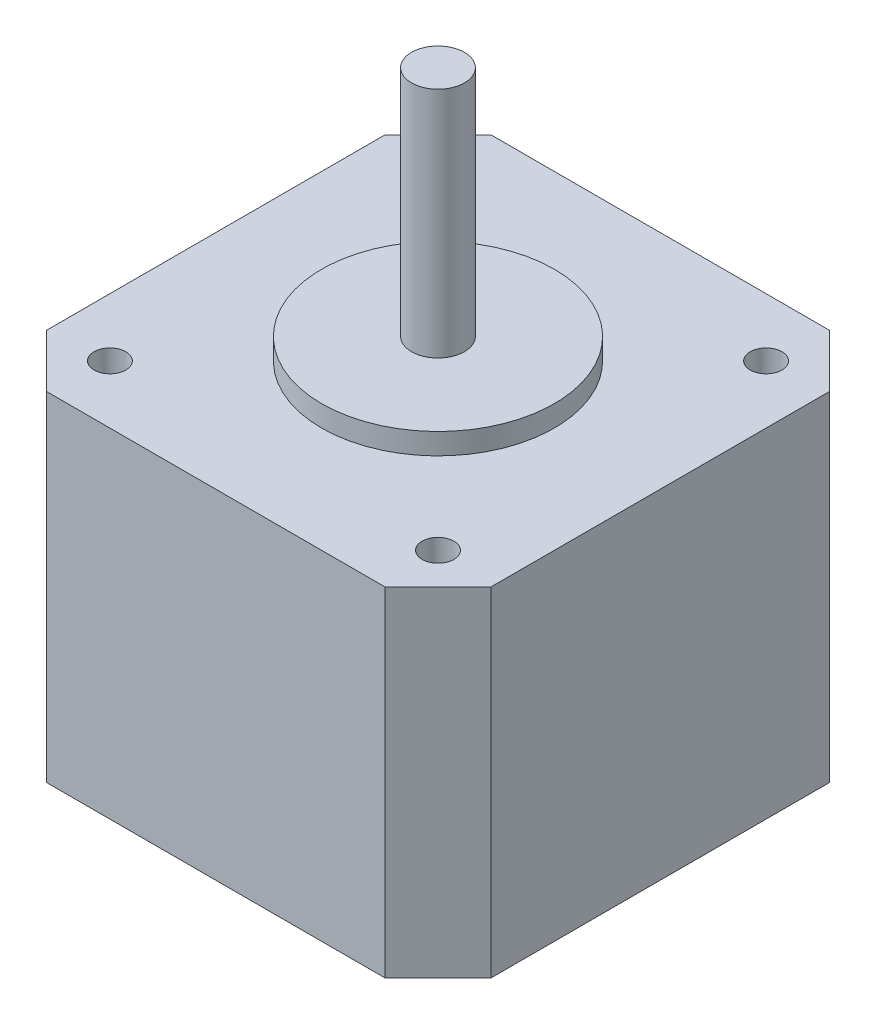
ISO-10303-21;
HEADER;
FILE_DESCRIPTION(('STEP AP214'),'2;1');
FILE_NAME('part.step','',(''),(''),'','','');
FILE_SCHEMA(('AUTOMOTIVE_DESIGN { 1 0 10303 214 1 1 1 1 }'));
ENDSEC;
DATA;
#1=APPLICATION_CONTEXT('core data for automotive mechanical design processes');
#2=APPLICATION_PROTOCOL_DEFINITION('international standard','automotive_design',2000,#1);
#3=PRODUCT_CONTEXT('',#1,'mechanical');
#4=PRODUCT('Part','Part','',(#3));
#5=PRODUCT_RELATED_PRODUCT_CATEGORY('part','',(#4));
#6=PRODUCT_DEFINITION_FORMATION('','',#4);
#7=PRODUCT_DEFINITION_CONTEXT('part definition',#1,'design');
#8=PRODUCT_DEFINITION('design','',#6,#7);
#9=PRODUCT_DEFINITION_SHAPE('','',#8);
#10=(LENGTH_UNIT() NAMED_UNIT(*) SI_UNIT(.MILLI.,.METRE.));
#11=(NAMED_UNIT(*) PLANE_ANGLE_UNIT() SI_UNIT($,.RADIAN.));
#12=(NAMED_UNIT(*) SI_UNIT($,.STERADIAN.) SOLID_ANGLE_UNIT());
#13=UNCERTAINTY_MEASURE_WITH_UNIT(LENGTH_MEASURE(1.E-05),#10,'distance_accuracy_value','');
#14=(GEOMETRIC_REPRESENTATION_CONTEXT(3) GLOBAL_UNCERTAINTY_ASSIGNED_CONTEXT((#13)) GLOBAL_UNIT_ASSIGNED_CONTEXT((#10,
#11,#12)) REPRESENTATION_CONTEXT('',''));
#15=CARTESIAN_POINT('',(0.,0.,0.));
#16=DIRECTION('',(0.,0.,1.));
#17=DIRECTION('',(1.,0.,0.));
#18=AXIS2_PLACEMENT_3D('',#15,#16,#17);
#19=CARTESIAN_POINT('',(21.,32.,21.));
#20=DIRECTION('',(-1.,0.,0.));
#21=DIRECTION('',(0.,0.,1.));
#22=AXIS2_PLACEMENT_3D('',#19,#20,#21);
#23=PLANE('',#22);
#24=DIRECTION('',(0.,0.,-1.));
#25=VECTOR('',#24,1.);
#26=CARTESIAN_POINT('',(21.,32.,21.));
#27=LINE('',#26,#25);
#28=CARTESIAN_POINT('',(21.,32.,16.));
#29=VERTEX_POINT('',#28);
#30=CARTESIAN_POINT('',(21.,32.,-16.));
#31=VERTEX_POINT('',#30);
#32=EDGE_CURVE('E117',#29,#31,#27,.T.);
#33=ORIENTED_EDGE('',*,*,#32,.F.);
#34=DIRECTION('',(0.,-1.,0.));
#35=VECTOR('',#34,1.);
#36=CARTESIAN_POINT('',(21.,32.,16.));
#37=LINE('',#36,#35);
#38=CARTESIAN_POINT('',(21.,0.,16.));
#39=VERTEX_POINT('',#38);
#40=EDGE_CURVE('E102',#29,#39,#37,.T.);
#41=ORIENTED_EDGE('',*,*,#40,.T.);
#42=DIRECTION('',(0.,0.,-1.));
#43=VECTOR('',#42,1.);
#44=CARTESIAN_POINT('',(21.,0.,21.));
#45=LINE('',#44,#43);
#46=CARTESIAN_POINT('',(21.,0.,-16.));
#47=VERTEX_POINT('',#46);
#48=EDGE_CURVE('E114',#39,#47,#45,.T.);
#49=ORIENTED_EDGE('',*,*,#48,.T.);
#50=DIRECTION('',(0.,1.,0.));
#51=VECTOR('',#50,1.);
#52=CARTESIAN_POINT('',(21.,32.,-16.));
#53=LINE('',#52,#51);
#54=EDGE_CURVE('E119',#47,#31,#53,.T.);
#55=ORIENTED_EDGE('',*,*,#54,.T.);
#56=EDGE_LOOP('',(#33,#41,#49,#55));
#57=FACE_BOUND('',#56,.T.);
#58=ADVANCED_FACE('F32',(#57),#23,.F.);
#59=CARTESIAN_POINT('',(-21.,32.,-21.));
#60=DIRECTION('',(0.,0.,1.));
#61=DIRECTION('',(1.,0.,0.));
#62=AXIS2_PLACEMENT_3D('',#59,#60,#61);
#63=PLANE('',#62);
#64=DIRECTION('',(-1.,0.,0.));
#65=VECTOR('',#64,1.);
#66=CARTESIAN_POINT('',(-21.,0.,-21.));
#67=LINE('',#66,#65);
#68=CARTESIAN_POINT('',(16.,0.,-21.));
#69=VERTEX_POINT('',#68);
#70=CARTESIAN_POINT('',(-16.,0.,-21.));
#71=VERTEX_POINT('',#70);
#72=EDGE_CURVE('E123',#69,#71,#67,.T.);
#73=ORIENTED_EDGE('',*,*,#72,.T.);
#74=DIRECTION('',(0.,1.,0.));
#75=VECTOR('',#74,1.);
#76=CARTESIAN_POINT('',(-16.,32.,-21.));
#77=LINE('',#76,#75);
#78=CARTESIAN_POINT('',(-16.,32.,-21.));
#79=VERTEX_POINT('',#78);
#80=EDGE_CURVE('E11',#71,#79,#77,.T.);
#81=ORIENTED_EDGE('',*,*,#80,.T.);
#82=DIRECTION('',(-1.,0.,0.));
#83=VECTOR('',#82,1.);
#84=CARTESIAN_POINT('',(-21.,32.,-21.));
#85=LINE('',#84,#83);
#86=CARTESIAN_POINT('',(16.,32.,-21.));
#87=VERTEX_POINT('',#86);
#88=EDGE_CURVE('E164',#87,#79,#85,.T.);
#89=ORIENTED_EDGE('',*,*,#88,.F.);
#90=DIRECTION('',(0.,-1.,0.));
#91=VECTOR('',#90,1.);
#92=CARTESIAN_POINT('',(16.,32.,-21.));
#93=LINE('',#92,#91);
#94=EDGE_CURVE('E40',#87,#69,#93,.T.);
#95=ORIENTED_EDGE('',*,*,#94,.T.);
#96=EDGE_LOOP('',(#73,#81,#89,#95));
#97=FACE_BOUND('',#96,.T.);
#98=ADVANCED_FACE('F162',(#97),#63,.F.);
#99=CARTESIAN_POINT('',(-21.,32.,21.));
#100=DIRECTION('',(1.,0.,0.));
#101=DIRECTION('',(0.,0.,-1.));
#102=AXIS2_PLACEMENT_3D('',#99,#100,#101);
#103=PLANE('',#102);
#104=DIRECTION('',(0.,0.,1.));
#105=VECTOR('',#104,1.);
#106=CARTESIAN_POINT('',(-21.,0.,21.));
#107=LINE('',#106,#105);
#108=CARTESIAN_POINT('',(-21.,0.,-16.));
#109=VERTEX_POINT('',#108);
#110=CARTESIAN_POINT('',(-21.,0.,16.));
#111=VERTEX_POINT('',#110);
#112=EDGE_CURVE('E127',#109,#111,#107,.T.);
#113=ORIENTED_EDGE('',*,*,#112,.T.);
#114=DIRECTION('',(0.,1.,0.));
#115=VECTOR('',#114,1.);
#116=CARTESIAN_POINT('',(-21.,32.,16.));
#117=LINE('',#116,#115);
#118=CARTESIAN_POINT('',(-21.,32.,16.));
#119=VERTEX_POINT('',#118);
#120=EDGE_CURVE('E47',#111,#119,#117,.T.);
#121=ORIENTED_EDGE('',*,*,#120,.T.);
#122=DIRECTION('',(0.,0.,1.));
#123=VECTOR('',#122,1.);
#124=CARTESIAN_POINT('',(-21.,32.,21.));
#125=LINE('',#124,#123);
#126=CARTESIAN_POINT('',(-21.,32.,-16.));
#127=VERTEX_POINT('',#126);
#128=EDGE_CURVE('E172',#127,#119,#125,.T.);
#129=ORIENTED_EDGE('',*,*,#128,.F.);
#130=DIRECTION('',(0.,-1.,0.));
#131=VECTOR('',#130,1.);
#132=CARTESIAN_POINT('',(-21.,32.,-16.));
#133=LINE('',#132,#131);
#134=EDGE_CURVE('E155',#127,#109,#133,.T.);
#135=ORIENTED_EDGE('',*,*,#134,.T.);
#136=EDGE_LOOP('',(#113,#121,#129,#135));
#137=FACE_BOUND('',#136,.T.);
#138=ADVANCED_FACE('F171',(#137),#103,.F.);
#139=CARTESIAN_POINT('',(-21.,32.,21.));
#140=DIRECTION('',(0.,0.,-1.));
#141=DIRECTION('',(-1.,0.,0.));
#142=AXIS2_PLACEMENT_3D('',#139,#140,#141);
#143=PLANE('',#142);
#144=DIRECTION('',(1.,0.,0.));
#145=VECTOR('',#144,1.);
#146=CARTESIAN_POINT('',(-21.,0.,21.));
#147=LINE('',#146,#145);
#148=CARTESIAN_POINT('',(-16.,0.,21.));
#149=VERTEX_POINT('',#148);
#150=CARTESIAN_POINT('',(16.,0.,21.));
#151=VERTEX_POINT('',#150);
#152=EDGE_CURVE('E137',#149,#151,#147,.T.);
#153=ORIENTED_EDGE('',*,*,#152,.T.);
#154=DIRECTION('',(0.,1.,0.));
#155=VECTOR('',#154,1.);
#156=CARTESIAN_POINT('',(16.,32.,21.));
#157=LINE('',#156,#155);
#158=CARTESIAN_POINT('',(16.,32.,21.));
#159=VERTEX_POINT('',#158);
#160=EDGE_CURVE('E103',#151,#159,#157,.T.);
#161=ORIENTED_EDGE('',*,*,#160,.T.);
#162=DIRECTION('',(1.,0.,0.));
#163=VECTOR('',#162,1.);
#164=CARTESIAN_POINT('',(-21.,32.,21.));
#165=LINE('',#164,#163);
#166=CARTESIAN_POINT('',(-16.,32.,21.));
#167=VERTEX_POINT('',#166);
#168=EDGE_CURVE('E133',#167,#159,#165,.T.);
#169=ORIENTED_EDGE('',*,*,#168,.F.);
#170=DIRECTION('',(0.,-1.,0.));
#171=VECTOR('',#170,1.);
#172=CARTESIAN_POINT('',(-16.,32.,21.));
#173=LINE('',#172,#171);
#174=EDGE_CURVE('E108',#167,#149,#173,.T.);
#175=ORIENTED_EDGE('',*,*,#174,.T.);
#176=EDGE_LOOP('',(#153,#161,#169,#175));
#177=FACE_BOUND('',#176,.T.);
#178=ADVANCED_FACE('F222',(#177),#143,.F.);
#179=CARTESIAN_POINT('',(0.,32.,0.));
#180=DIRECTION('',(0.,-1.,0.));
#181=DIRECTION('',(0.,0.,-1.));
#182=AXIS2_PLACEMENT_3D('',#179,#180,#181);
#183=PLANE('',#182);
#184=CARTESIAN_POINT('',(-15.5,32.,-15.5));
#185=DIRECTION('',(0.,1.,0.));
#186=DIRECTION('',(0.,0.,1.));
#187=AXIS2_PLACEMENT_3D('',#184,#185,#186);
#188=CIRCLE('',#187,1.5);
#189=CARTESIAN_POINT('',(-15.5,32.,-14.));
#190=VERTEX_POINT('',#189);
#191=EDGE_CURVE('E192',#190,#190,#188,.T.);
#192=ORIENTED_EDGE('',*,*,#191,.F.);
#193=EDGE_LOOP('',(#192));
#194=FACE_BOUND('',#193,.T.);
#195=CARTESIAN_POINT('',(-15.5,32.,15.5));
#196=DIRECTION('',(0.,1.,0.));
#197=DIRECTION('',(0.,0.,1.));
#198=AXIS2_PLACEMENT_3D('',#195,#196,#197);
#199=CIRCLE('',#198,1.5);
#200=CARTESIAN_POINT('',(-15.5,32.,17.));
#201=VERTEX_POINT('',#200);
#202=EDGE_CURVE('E198',#201,#201,#199,.T.);
#203=ORIENTED_EDGE('',*,*,#202,.F.);
#204=EDGE_LOOP('',(#203));
#205=FACE_BOUND('',#204,.T.);
#206=CARTESIAN_POINT('',(15.5,32.,15.5));
#207=DIRECTION('',(0.,1.,0.));
#208=DIRECTION('',(0.,0.,1.));
#209=AXIS2_PLACEMENT_3D('',#206,#207,#208);
#210=CIRCLE('',#209,1.5);
#211=CARTESIAN_POINT('',(15.5,32.,17.));
#212=VERTEX_POINT('',#211);
#213=EDGE_CURVE('E204',#212,#212,#210,.T.);
#214=ORIENTED_EDGE('',*,*,#213,.F.);
#215=EDGE_LOOP('',(#214));
#216=FACE_BOUND('',#215,.T.);
#217=CARTESIAN_POINT('',(15.5,32.,-15.5));
#218=DIRECTION('',(0.,1.,0.));
#219=DIRECTION('',(0.,0.,1.));
#220=AXIS2_PLACEMENT_3D('',#217,#218,#219);
#221=CIRCLE('',#220,1.5);
#222=CARTESIAN_POINT('',(15.5,32.,-14.));
#223=VERTEX_POINT('',#222);
#224=EDGE_CURVE('E186',#223,#223,#221,.T.);
#225=ORIENTED_EDGE('',*,*,#224,.F.);
#226=EDGE_LOOP('',(#225));
#227=FACE_BOUND('',#226,.T.);
#228=CARTESIAN_POINT('',(0.,32.,0.));
#229=DIRECTION('',(0.,1.,0.));
#230=DIRECTION('',(0.,0.,1.));
#231=AXIS2_PLACEMENT_3D('',#228,#229,#230);
#232=CIRCLE('',#231,11.);
#233=CARTESIAN_POINT('',(0.,32.,11.));
#234=VERTEX_POINT('',#233);
#235=EDGE_CURVE('E175',#234,#234,#232,.T.);
#236=ORIENTED_EDGE('',*,*,#235,.F.);
#237=EDGE_LOOP('',(#236));
#238=FACE_BOUND('',#237,.T.);
#239=ORIENTED_EDGE('',*,*,#168,.T.);
#240=DIRECTION('',(-0.707106781186548,0.,0.707106781186548));
#241=VECTOR('',#240,1.);
#242=CARTESIAN_POINT('',(21.,32.,16.));
#243=LINE('',#242,#241);
#244=EDGE_CURVE('E153',#159,#29,#243,.F.);
#245=ORIENTED_EDGE('',*,*,#244,.T.);
#246=ORIENTED_EDGE('',*,*,#32,.T.);
#247=DIRECTION('',(0.707106781186548,0.,0.707106781186548));
#248=VECTOR('',#247,1.);
#249=CARTESIAN_POINT('',(16.,32.,-21.));
#250=LINE('',#249,#248);
#251=EDGE_CURVE('E148',#31,#87,#250,.F.);
#252=ORIENTED_EDGE('',*,*,#251,.T.);
#253=ORIENTED_EDGE('',*,*,#88,.T.);
#254=DIRECTION('',(0.707106781186548,0.,-0.707106781186548));
#255=VECTOR('',#254,1.);
#256=CARTESIAN_POINT('',(-21.,32.,-16.));
#257=LINE('',#256,#255);
#258=EDGE_CURVE('E54',#79,#127,#257,.F.);
#259=ORIENTED_EDGE('',*,*,#258,.T.);
#260=ORIENTED_EDGE('',*,*,#128,.T.);
#261=DIRECTION('',(-0.707106781186548,0.,-0.707106781186548));
#262=VECTOR('',#261,1.);
#263=CARTESIAN_POINT('',(-16.,32.,21.));
#264=LINE('',#263,#262);
#265=EDGE_CURVE('E151',#119,#167,#264,.F.);
#266=ORIENTED_EDGE('',*,*,#265,.T.);
#267=EDGE_LOOP('',(#239,#245,#246,#252,#253,#259,#260,#266));
#268=FACE_BOUND('',#267,.T.);
#269=ADVANCED_FACE('F219',(#194,#205,#216,#227,#238,#268),#183,.F.);
#270=CARTESIAN_POINT('',(0.,0.,0.));
#271=DIRECTION('',(0.,-1.,0.));
#272=DIRECTION('',(0.,0.,-1.));
#273=AXIS2_PLACEMENT_3D('',#270,#271,#272);
#274=PLANE('',#273);
#275=ORIENTED_EDGE('',*,*,#48,.F.);
#276=DIRECTION('',(0.707106781186548,0.,-0.707106781186548));
#277=VECTOR('',#276,1.);
#278=CARTESIAN_POINT('',(18.5,0.,18.5));
#279=LINE('',#278,#277);
#280=EDGE_CURVE('E98',#39,#151,#279,.F.);
#281=ORIENTED_EDGE('',*,*,#280,.T.);
#282=ORIENTED_EDGE('',*,*,#152,.F.);
#283=DIRECTION('',(0.707106781186548,0.,0.707106781186548));
#284=VECTOR('',#283,1.);
#285=CARTESIAN_POINT('',(-18.5,0.,18.5));
#286=LINE('',#285,#284);
#287=EDGE_CURVE('E109',#149,#111,#286,.F.);
#288=ORIENTED_EDGE('',*,*,#287,.T.);
#289=ORIENTED_EDGE('',*,*,#112,.F.);
#290=DIRECTION('',(-0.707106781186548,0.,0.707106781186548));
#291=VECTOR('',#290,1.);
#292=CARTESIAN_POINT('',(-18.5,0.,-18.5));
#293=LINE('',#292,#291);
#294=EDGE_CURVE('E142',#109,#71,#293,.F.);
#295=ORIENTED_EDGE('',*,*,#294,.T.);
#296=ORIENTED_EDGE('',*,*,#72,.F.);
#297=DIRECTION('',(-0.707106781186548,0.,-0.707106781186548));
#298=VECTOR('',#297,1.);
#299=CARTESIAN_POINT('',(18.5,0.,-18.5));
#300=LINE('',#299,#298);
#301=EDGE_CURVE('E118',#69,#47,#300,.F.);
#302=ORIENTED_EDGE('',*,*,#301,.T.);
#303=EDGE_LOOP('',(#275,#281,#282,#288,#289,#295,#296,#302));
#304=FACE_BOUND('',#303,.T.);
#305=ADVANCED_FACE('F121',(#304),#274,.T.);
#306=CARTESIAN_POINT('',(0.,34.,0.));
#307=DIRECTION('',(0.,-1.,0.));
#308=DIRECTION('',(0.,0.,-1.));
#309=AXIS2_PLACEMENT_3D('',#306,#307,#308);
#310=CYLINDRICAL_SURFACE('',#309,11.);
#311=CARTESIAN_POINT('',(0.,34.,0.));
#312=DIRECTION('',(0.,1.,0.));
#313=DIRECTION('',(0.,0.,1.));
#314=AXIS2_PLACEMENT_3D('',#311,#312,#313);
#315=CIRCLE('',#314,11.);
#316=CARTESIAN_POINT('',(0.,34.,11.));
#317=VERTEX_POINT('',#316);
#318=EDGE_CURVE('E124',#317,#317,#315,.T.);
#319=ORIENTED_EDGE('',*,*,#318,.F.);
#320=EDGE_LOOP('',(#319));
#321=FACE_BOUND('',#320,.T.);
#322=ORIENTED_EDGE('',*,*,#235,.T.);
#323=EDGE_LOOP('',(#322));
#324=FACE_BOUND('',#323,.T.);
#325=ADVANCED_FACE('F253',(#321,#324),#310,.T.);
#326=CARTESIAN_POINT('',(0.,34.,0.));
#327=DIRECTION('',(0.,1.,0.));
#328=DIRECTION('',(0.,0.,1.));
#329=AXIS2_PLACEMENT_3D('',#326,#327,#328);
#330=PLANE('',#329);
#331=CARTESIAN_POINT('',(0.,34.,0.));
#332=DIRECTION('',(0.,1.,0.));
#333=DIRECTION('',(0.,0.,1.));
#334=AXIS2_PLACEMENT_3D('',#331,#332,#333);
#335=CIRCLE('',#334,2.5);
#336=CARTESIAN_POINT('',(0.,34.,2.5));
#337=VERTEX_POINT('',#336);
#338=EDGE_CURVE('E139',#337,#337,#335,.T.);
#339=ORIENTED_EDGE('',*,*,#338,.F.);
#340=EDGE_LOOP('',(#339));
#341=FACE_BOUND('',#340,.T.);
#342=ORIENTED_EDGE('',*,*,#318,.T.);
#343=EDGE_LOOP('',(#342));
#344=FACE_BOUND('',#343,.T.);
#345=ADVANCED_FACE('F257',(#341,#344),#330,.T.);
#346=CARTESIAN_POINT('',(0.,56.,0.));
#347=DIRECTION('',(0.,-1.,0.));
#348=DIRECTION('',(0.,0.,-1.));
#349=AXIS2_PLACEMENT_3D('',#346,#347,#348);
#350=CYLINDRICAL_SURFACE('',#349,2.5);
#351=CARTESIAN_POINT('',(0.,56.,0.));
#352=DIRECTION('',(0.,1.,0.));
#353=DIRECTION('',(0.,0.,1.));
#354=AXIS2_PLACEMENT_3D('',#351,#352,#353);
#355=CIRCLE('',#354,2.5);
#356=CARTESIAN_POINT('',(0.,56.,2.5));
#357=VERTEX_POINT('',#356);
#358=EDGE_CURVE('E130',#357,#357,#355,.T.);
#359=ORIENTED_EDGE('',*,*,#358,.F.);
#360=EDGE_LOOP('',(#359));
#361=FACE_BOUND('',#360,.T.);
#362=ORIENTED_EDGE('',*,*,#338,.T.);
#363=EDGE_LOOP('',(#362));
#364=FACE_BOUND('',#363,.T.);
#365=ADVANCED_FACE('F261',(#361,#364),#350,.T.);
#366=CARTESIAN_POINT('',(0.,56.,0.));
#367=DIRECTION('',(0.,1.,0.));
#368=DIRECTION('',(0.,0.,1.));
#369=AXIS2_PLACEMENT_3D('',#366,#367,#368);
#370=PLANE('',#369);
#371=ORIENTED_EDGE('',*,*,#358,.T.);
#372=EDGE_LOOP('',(#371));
#373=FACE_BOUND('',#372,.T.);
#374=ADVANCED_FACE('F265',(#373),#370,.T.);
#375=CARTESIAN_POINT('',(15.5,27.,-15.5));
#376=DIRECTION('',(0.,1.,0.));
#377=DIRECTION('',(0.,0.,1.));
#378=AXIS2_PLACEMENT_3D('',#375,#376,#377);
#379=CYLINDRICAL_SURFACE('',#378,1.5);
#380=CARTESIAN_POINT('',(15.5,27.,-15.5));
#381=DIRECTION('',(0.,1.,0.));
#382=DIRECTION('',(0.,0.,1.));
#383=AXIS2_PLACEMENT_3D('',#380,#381,#382);
#384=CIRCLE('',#383,1.5);
#385=CARTESIAN_POINT('',(15.5,27.,-14.));
#386=VERTEX_POINT('',#385);
#387=EDGE_CURVE('E185',#386,#386,#384,.T.);
#388=ORIENTED_EDGE('',*,*,#387,.F.);
#389=EDGE_LOOP('',(#388));
#390=FACE_BOUND('',#389,.T.);
#391=ORIENTED_EDGE('',*,*,#224,.T.);
#392=EDGE_LOOP('',(#391));
#393=FACE_BOUND('',#392,.T.);
#394=ADVANCED_FACE('F269',(#390,#393),#379,.F.);
#395=CARTESIAN_POINT('',(15.5,27.,-15.5));
#396=DIRECTION('',(0.,1.,0.));
#397=DIRECTION('',(0.,0.,1.));
#398=AXIS2_PLACEMENT_3D('',#395,#396,#397);
#399=PLANE('',#398);
#400=ORIENTED_EDGE('',*,*,#387,.T.);
#401=EDGE_LOOP('',(#400));
#402=FACE_BOUND('',#401,.T.);
#403=ADVANCED_FACE('F215',(#402),#399,.T.);
#404=CARTESIAN_POINT('',(15.5,27.,15.5));
#405=DIRECTION('',(0.,1.,0.));
#406=DIRECTION('',(0.,0.,1.));
#407=AXIS2_PLACEMENT_3D('',#404,#405,#406);
#408=CYLINDRICAL_SURFACE('',#407,1.5);
#409=CARTESIAN_POINT('',(15.5,27.,15.5));
#410=DIRECTION('',(0.,1.,0.));
#411=DIRECTION('',(0.,0.,1.));
#412=AXIS2_PLACEMENT_3D('',#409,#410,#411);
#413=CIRCLE('',#412,1.5);
#414=CARTESIAN_POINT('',(15.5,27.,17.));
#415=VERTEX_POINT('',#414);
#416=EDGE_CURVE('E189',#415,#415,#413,.T.);
#417=ORIENTED_EDGE('',*,*,#416,.F.);
#418=EDGE_LOOP('',(#417));
#419=FACE_BOUND('',#418,.T.);
#420=ORIENTED_EDGE('',*,*,#213,.T.);
#421=EDGE_LOOP('',(#420));
#422=FACE_BOUND('',#421,.T.);
#423=ADVANCED_FACE('F212',(#419,#422),#408,.F.);
#424=CARTESIAN_POINT('',(15.5,27.,15.5));
#425=DIRECTION('',(0.,1.,0.));
#426=DIRECTION('',(0.,0.,1.));
#427=AXIS2_PLACEMENT_3D('',#424,#425,#426);
#428=PLANE('',#427);
#429=ORIENTED_EDGE('',*,*,#416,.T.);
#430=EDGE_LOOP('',(#429));
#431=FACE_BOUND('',#430,.T.);
#432=ADVANCED_FACE('F210',(#431),#428,.T.);
#433=CARTESIAN_POINT('',(-15.5,27.,15.5));
#434=DIRECTION('',(0.,1.,0.));
#435=DIRECTION('',(0.,0.,1.));
#436=AXIS2_PLACEMENT_3D('',#433,#434,#435);
#437=CYLINDRICAL_SURFACE('',#436,1.5);
#438=CARTESIAN_POINT('',(-15.5,27.,15.5));
#439=DIRECTION('',(0.,1.,0.));
#440=DIRECTION('',(0.,0.,1.));
#441=AXIS2_PLACEMENT_3D('',#438,#439,#440);
#442=CIRCLE('',#441,1.5);
#443=CARTESIAN_POINT('',(-15.5,27.,17.));
#444=VERTEX_POINT('',#443);
#445=EDGE_CURVE('E201',#444,#444,#442,.T.);
#446=ORIENTED_EDGE('',*,*,#445,.F.);
#447=EDGE_LOOP('',(#446));
#448=FACE_BOUND('',#447,.T.);
#449=ORIENTED_EDGE('',*,*,#202,.T.);
#450=EDGE_LOOP('',(#449));
#451=FACE_BOUND('',#450,.T.);
#452=ADVANCED_FACE('F285',(#448,#451),#437,.F.);
#453=CARTESIAN_POINT('',(-15.5,27.,15.5));
#454=DIRECTION('',(0.,1.,0.));
#455=DIRECTION('',(0.,0.,1.));
#456=AXIS2_PLACEMENT_3D('',#453,#454,#455);
#457=PLANE('',#456);
#458=ORIENTED_EDGE('',*,*,#445,.T.);
#459=EDGE_LOOP('',(#458));
#460=FACE_BOUND('',#459,.T.);
#461=ADVANCED_FACE('F280',(#460),#457,.T.);
#462=CARTESIAN_POINT('',(-15.5,27.,-15.5));
#463=DIRECTION('',(0.,1.,0.));
#464=DIRECTION('',(0.,0.,1.));
#465=AXIS2_PLACEMENT_3D('',#462,#463,#464);
#466=CYLINDRICAL_SURFACE('',#465,1.5);
#467=CARTESIAN_POINT('',(-15.5,27.,-15.5));
#468=DIRECTION('',(0.,1.,0.));
#469=DIRECTION('',(0.,0.,1.));
#470=AXIS2_PLACEMENT_3D('',#467,#468,#469);
#471=CIRCLE('',#470,1.5);
#472=CARTESIAN_POINT('',(-15.5,27.,-14.));
#473=VERTEX_POINT('',#472);
#474=EDGE_CURVE('E195',#473,#473,#471,.T.);
#475=ORIENTED_EDGE('',*,*,#474,.F.);
#476=EDGE_LOOP('',(#475));
#477=FACE_BOUND('',#476,.T.);
#478=ORIENTED_EDGE('',*,*,#191,.T.);
#479=EDGE_LOOP('',(#478));
#480=FACE_BOUND('',#479,.T.);
#481=ADVANCED_FACE('F277',(#477,#480),#466,.F.);
#482=CARTESIAN_POINT('',(-15.5,27.,-15.5));
#483=DIRECTION('',(0.,1.,0.));
#484=DIRECTION('',(0.,0.,1.));
#485=AXIS2_PLACEMENT_3D('',#482,#483,#484);
#486=PLANE('',#485);
#487=ORIENTED_EDGE('',*,*,#474,.T.);
#488=EDGE_LOOP('',(#487));
#489=FACE_BOUND('',#488,.T.);
#490=ADVANCED_FACE('F239',(#489),#486,.T.);
#491=CARTESIAN_POINT('',(21.,32.,16.));
#492=DIRECTION('',(-0.707106781186548,0.,-0.707106781186548));
#493=DIRECTION('',(0.,-1.,0.));
#494=AXIS2_PLACEMENT_3D('',#491,#492,#493);
#495=PLANE('',#494);
#496=ORIENTED_EDGE('',*,*,#244,.F.);
#497=ORIENTED_EDGE('',*,*,#160,.F.);
#498=ORIENTED_EDGE('',*,*,#280,.F.);
#499=ORIENTED_EDGE('',*,*,#40,.F.);
#500=EDGE_LOOP('',(#496,#497,#498,#499));
#501=FACE_BOUND('',#500,.T.);
#502=ADVANCED_FACE('F101',(#501),#495,.F.);
#503=CARTESIAN_POINT('',(-16.,32.,21.));
#504=DIRECTION('',(0.707106781186548,0.,-0.707106781186548));
#505=DIRECTION('',(0.,-1.,0.));
#506=AXIS2_PLACEMENT_3D('',#503,#504,#505);
#507=PLANE('',#506);
#508=ORIENTED_EDGE('',*,*,#265,.F.);
#509=ORIENTED_EDGE('',*,*,#120,.F.);
#510=ORIENTED_EDGE('',*,*,#287,.F.);
#511=ORIENTED_EDGE('',*,*,#174,.F.);
#512=EDGE_LOOP('',(#508,#509,#510,#511));
#513=FACE_BOUND('',#512,.T.);
#514=ADVANCED_FACE('F232',(#513),#507,.F.);
#515=CARTESIAN_POINT('',(-21.,32.,-16.));
#516=DIRECTION('',(0.707106781186548,0.,0.707106781186548));
#517=DIRECTION('',(0.,-1.,0.));
#518=AXIS2_PLACEMENT_3D('',#515,#516,#517);
#519=PLANE('',#518);
#520=ORIENTED_EDGE('',*,*,#258,.F.);
#521=ORIENTED_EDGE('',*,*,#80,.F.);
#522=ORIENTED_EDGE('',*,*,#294,.F.);
#523=ORIENTED_EDGE('',*,*,#134,.F.);
#524=EDGE_LOOP('',(#520,#521,#522,#523));
#525=FACE_BOUND('',#524,.T.);
#526=ADVANCED_FACE('F170',(#525),#519,.F.);
#527=CARTESIAN_POINT('',(16.,32.,-21.));
#528=DIRECTION('',(-0.707106781186548,0.,0.707106781186548));
#529=DIRECTION('',(0.,-1.,0.));
#530=AXIS2_PLACEMENT_3D('',#527,#528,#529);
#531=PLANE('',#530);
#532=ORIENTED_EDGE('',*,*,#251,.F.);
#533=ORIENTED_EDGE('',*,*,#54,.F.);
#534=ORIENTED_EDGE('',*,*,#301,.F.);
#535=ORIENTED_EDGE('',*,*,#94,.F.);
#536=EDGE_LOOP('',(#532,#533,#534,#535));
#537=FACE_BOUND('',#536,.T.);
#538=ADVANCED_FACE('F34',(#537),#531,.F.);
#539=CLOSED_SHELL('',(#58,#98,#138,#178,#269,#305,#325,#345,#365,#374,#394,#403,#423,#432,#452,
#461,#481,#490,#502,#514,#526,#538));
#540=MANIFOLD_SOLID_BREP('B2',#539);
#541=ADVANCED_BREP_SHAPE_REPRESENTATION('',(#18,#540),#14);
#542=SHAPE_DEFINITION_REPRESENTATION(#9,#541);
ENDSEC;
END-ISO-10303-21;
